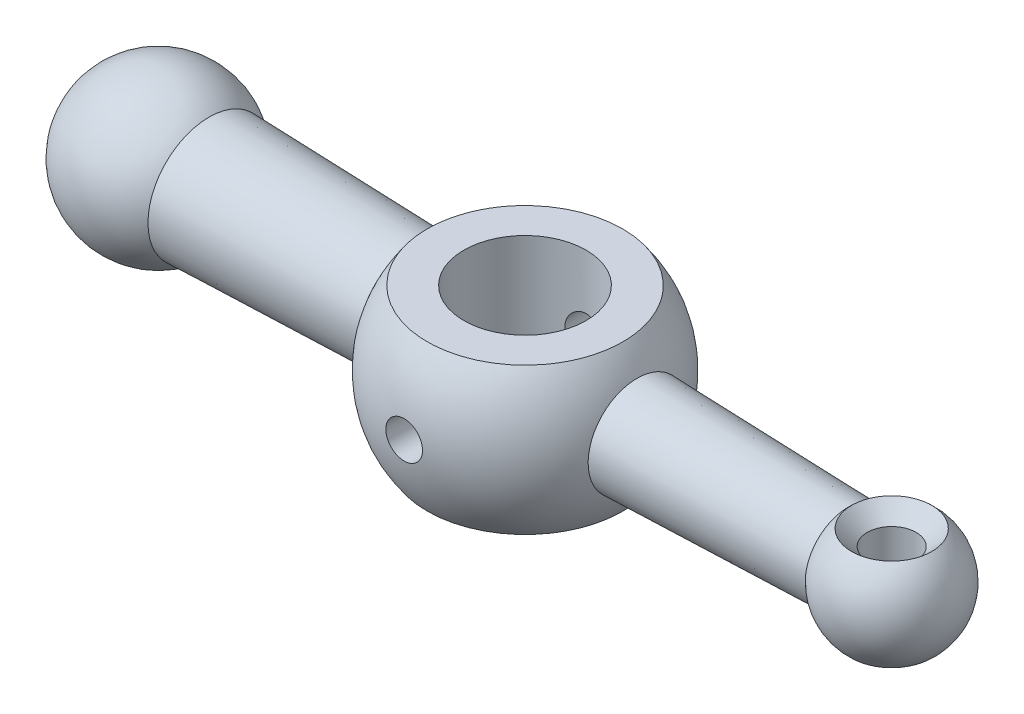
ISO-10303-21;
HEADER;
FILE_DESCRIPTION(('STEP AP214'),'2;1');
FILE_NAME('part.step','',(''),(''),'','','');
FILE_SCHEMA(('AUTOMOTIVE_DESIGN { 1 0 10303 214 1 1 1 1 }'));
ENDSEC;
DATA;
#1=APPLICATION_CONTEXT('core data for automotive mechanical design processes');
#2=APPLICATION_PROTOCOL_DEFINITION('international standard','automotive_design',2000,#1);
#3=PRODUCT_CONTEXT('',#1,'mechanical');
#4=PRODUCT('Part','Part','',(#3));
#5=PRODUCT_RELATED_PRODUCT_CATEGORY('part','',(#4));
#6=PRODUCT_DEFINITION_FORMATION('','',#4);
#7=PRODUCT_DEFINITION_CONTEXT('part definition',#1,'design');
#8=PRODUCT_DEFINITION('design','',#6,#7);
#9=PRODUCT_DEFINITION_SHAPE('','',#8);
#10=(LENGTH_UNIT() NAMED_UNIT(*) SI_UNIT(.MILLI.,.METRE.));
#11=(NAMED_UNIT(*) PLANE_ANGLE_UNIT() SI_UNIT($,.RADIAN.));
#12=(NAMED_UNIT(*) SI_UNIT($,.STERADIAN.) SOLID_ANGLE_UNIT());
#13=UNCERTAINTY_MEASURE_WITH_UNIT(LENGTH_MEASURE(1.E-05),#10,'distance_accuracy_value','');
#14=(GEOMETRIC_REPRESENTATION_CONTEXT(3) GLOBAL_UNCERTAINTY_ASSIGNED_CONTEXT((#13)) GLOBAL_UNIT_ASSIGNED_CONTEXT((#10,
#11,#12)) REPRESENTATION_CONTEXT('',''));
#15=CARTESIAN_POINT('',(0.,0.,0.));
#16=DIRECTION('',(0.,0.,1.));
#17=DIRECTION('',(1.,0.,0.));
#18=AXIS2_PLACEMENT_3D('',#15,#16,#17);
#19=CARTESIAN_POINT('',(60.,0.,0.));
#20=DIRECTION('',(-1.,0.,0.));
#21=DIRECTION('',(0.,-1.,0.));
#22=AXIS2_PLACEMENT_3D('',#19,#20,#21);
#23=SPHERICAL_SURFACE('',#22,10.);
#24=CARTESIAN_POINT('',(60.,-7.55336798983293,0.));
#25=DIRECTION('',(0.,-1.,0.));
#26=DIRECTION('',(0.,0.,-1.));
#27=AXIS2_PLACEMENT_3D('',#24,#25,#26);
#28=CIRCLE('',#27,6.55336798983296);
#29=CARTESIAN_POINT('',(60.,-7.55336798983293,-6.55336798983296));
#30=VERTEX_POINT('',#29);
#31=EDGE_CURVE('E10',#30,#30,#28,.F.);
#32=ORIENTED_EDGE('',*,*,#31,.T.);
#33=EDGE_LOOP('',(#32));
#34=FACE_BOUND('',#33,.T.);
#35=CARTESIAN_POINT('',(60.,7.55336798983292,0.));
#36=DIRECTION('',(0.,1.,0.));
#37=DIRECTION('',(0.,0.,1.));
#38=AXIS2_PLACEMENT_3D('',#35,#36,#37);
#39=CIRCLE('',#38,6.55336798983296);
#40=CARTESIAN_POINT('',(60.,7.55336798983292,6.55336798983296));
#41=VERTEX_POINT('',#40);
#42=EDGE_CURVE('E49',#41,#41,#39,.F.);
#43=ORIENTED_EDGE('',*,*,#42,.T.);
#44=EDGE_LOOP('',(#43));
#45=FACE_BOUND('',#44,.T.);
#46=CARTESIAN_POINT('',(52.8717651351015,0.,0.));
#47=DIRECTION('',(-1.,0.,0.));
#48=DIRECTION('',(0.,-1.,0.));
#49=AXIS2_PLACEMENT_3D('',#46,#47,#48);
#50=CIRCLE('',#49,7.01343480121155);
#51=CARTESIAN_POINT('',(52.8717651351015,-7.01343480121155,0.));
#52=VERTEX_POINT('',#51);
#53=EDGE_CURVE('E121',#52,#52,#50,.T.);
#54=ORIENTED_EDGE('',*,*,#53,.F.);
#55=EDGE_LOOP('',(#54));
#56=FACE_BOUND('',#55,.T.);
#57=ADVANCED_FACE('F37',(#34,#45,#56),#23,.T.);
#58=CARTESIAN_POINT('',(0.,0.,0.));
#59=DIRECTION('',(-1.,0.,0.));
#60=DIRECTION('',(0.,1.,0.));
#61=AXIS2_PLACEMENT_3D('',#58,#59,#60);
#62=SPHERICAL_SURFACE('',#61,20.);
#63=CARTESIAN_POINT('',(0.,0.,19.7737199332852));
#64=DIRECTION('',(0.,0.,-1.));
#65=DIRECTION('',(-1.,0.,0.));
#66=AXIS2_PLACEMENT_3D('',#63,#64,#65);
#67=CIRCLE('',#66,3.);
#68=CARTESIAN_POINT('',(-3.,0.,19.7737199332852));
#69=VERTEX_POINT('',#68);
#70=EDGE_CURVE('E232',#69,#69,#67,.T.);
#71=ORIENTED_EDGE('',*,*,#70,.T.);
#72=EDGE_LOOP('',(#71));
#73=FACE_BOUND('',#72,.T.);
#74=CARTESIAN_POINT('',(0.,0.,-19.7737199332852));
#75=DIRECTION('',(0.,0.,1.));
#76=DIRECTION('',(1.,0.,0.));
#77=AXIS2_PLACEMENT_3D('',#74,#75,#76);
#78=CIRCLE('',#77,3.);
#79=CARTESIAN_POINT('',(3.,0.,-19.7737199332852));
#80=VERTEX_POINT('',#79);
#81=EDGE_CURVE('E235',#80,#80,#78,.T.);
#82=ORIENTED_EDGE('',*,*,#81,.T.);
#83=EDGE_LOOP('',(#82));
#84=FACE_BOUND('',#83,.T.);
#85=CARTESIAN_POINT('',(0.,12.,0.));
#86=DIRECTION('',(0.,-1.,0.));
#87=DIRECTION('',(0.,0.,-1.));
#88=AXIS2_PLACEMENT_3D('',#85,#86,#87);
#89=CIRCLE('',#88,16.);
#90=CARTESIAN_POINT('',(0.,12.,-16.));
#91=VERTEX_POINT('',#90);
#92=EDGE_CURVE('E109',#91,#91,#89,.T.);
#93=ORIENTED_EDGE('',*,*,#92,.T.);
#94=EDGE_LOOP('',(#93));
#95=FACE_BOUND('',#94,.T.);
#96=CARTESIAN_POINT('',(-17.8438045926734,0.,0.));
#97=DIRECTION('',(-1.,0.,0.));
#98=DIRECTION('',(0.,-1.,0.));
#99=AXIS2_PLACEMENT_3D('',#96,#97,#98);
#100=CIRCLE('',#99,9.03319642532417);
#101=CARTESIAN_POINT('',(-17.8438045926734,-9.03319642532417,0.));
#102=VERTEX_POINT('',#101);
#103=EDGE_CURVE('E108',#102,#102,#100,.T.);
#104=ORIENTED_EDGE('',*,*,#103,.F.);
#105=EDGE_LOOP('',(#104));
#106=FACE_BOUND('',#105,.T.);
#107=CARTESIAN_POINT('',(18.3303027798234,0.,0.));
#108=DIRECTION('',(-1.,0.,0.));
#109=DIRECTION('',(0.,-1.,0.));
#110=AXIS2_PLACEMENT_3D('',#107,#108,#109);
#111=CIRCLE('',#110,8.00000000000001);
#112=CARTESIAN_POINT('',(18.3303027798234,-8.00000000000001,0.));
#113=VERTEX_POINT('',#112);
#114=EDGE_CURVE('E112',#113,#113,#111,.T.);
#115=ORIENTED_EDGE('',*,*,#114,.T.);
#116=EDGE_LOOP('',(#115));
#117=FACE_BOUND('',#116,.T.);
#118=CARTESIAN_POINT('',(0.,-12.,0.));
#119=DIRECTION('',(0.,-1.,0.));
#120=DIRECTION('',(0.,0.,-1.));
#121=AXIS2_PLACEMENT_3D('',#118,#119,#120);
#122=CIRCLE('',#121,16.);
#123=CARTESIAN_POINT('',(0.,-12.,-16.));
#124=VERTEX_POINT('',#123);
#125=EDGE_CURVE('E115',#124,#124,#122,.T.);
#126=ORIENTED_EDGE('',*,*,#125,.F.);
#127=EDGE_LOOP('',(#126));
#128=FACE_BOUND('',#127,.T.);
#129=ADVANCED_FACE('F85',(#73,#84,#95,#106,#117,#128),#62,.T.);
#130=CARTESIAN_POINT('',(-60.,0.,0.));
#131=DIRECTION('',(-1.,0.,0.));
#132=DIRECTION('',(0.,1.,0.));
#133=AXIS2_PLACEMENT_3D('',#130,#131,#132);
#134=SPHERICAL_SURFACE('',#133,13.);
#135=CARTESIAN_POINT('',(-51.6933761370819,0.,0.));
#136=DIRECTION('',(-1.,0.,0.));
#137=DIRECTION('',(0.,-1.,0.));
#138=AXIS2_PLACEMENT_3D('',#135,#136,#137);
#139=CIRCLE('',#138,10.);
#140=CARTESIAN_POINT('',(-51.6933761370819,-10.,0.));
#141=VERTEX_POINT('',#140);
#142=EDGE_CURVE('E106',#141,#141,#139,.T.);
#143=ORIENTED_EDGE('',*,*,#142,.T.);
#144=EDGE_LOOP('',(#143));
#145=FACE_BOUND('',#144,.T.);
#146=ADVANCED_FACE('F90',(#145),#134,.T.);
#147=CARTESIAN_POINT('',(52.8717651351015,0.,0.));
#148=DIRECTION('',(-1.,0.,0.));
#149=DIRECTION('',(0.,-1.,0.));
#150=AXIS2_PLACEMENT_3D('',#147,#148,#149);
#151=CONICAL_SURFACE('',#150,7.01343480121155,0.0285540041208688);
#152=ORIENTED_EDGE('',*,*,#114,.F.);
#153=EDGE_LOOP('',(#152));
#154=FACE_BOUND('',#153,.T.);
#155=ORIENTED_EDGE('',*,*,#53,.T.);
#156=EDGE_LOOP('',(#155));
#157=FACE_BOUND('',#156,.T.);
#158=ADVANCED_FACE('F96',(#154,#157),#151,.T.);
#159=CARTESIAN_POINT('',(-17.8438045926734,0.,0.));
#160=DIRECTION('',(-1.,0.,0.));
#161=DIRECTION('',(0.,-1.,0.));
#162=AXIS2_PLACEMENT_3D('',#159,#160,#161);
#163=CONICAL_SURFACE('',#162,9.03319642532417,0.0285540041208687);
#164=ORIENTED_EDGE('',*,*,#142,.F.);
#165=EDGE_LOOP('',(#164));
#166=FACE_BOUND('',#165,.T.);
#167=ORIENTED_EDGE('',*,*,#103,.T.);
#168=EDGE_LOOP('',(#167));
#169=FACE_BOUND('',#168,.T.);
#170=ADVANCED_FACE('F102',(#166,#169),#163,.T.);
#171=CARTESIAN_POINT('',(10.,12.,0.));
#172=DIRECTION('',(0.,-1.,0.));
#173=DIRECTION('',(0.,0.,-1.));
#174=AXIS2_PLACEMENT_3D('',#171,#172,#173);
#175=PLANE('',#174);
#176=ORIENTED_EDGE('',*,*,#92,.F.);
#177=EDGE_LOOP('',(#176));
#178=FACE_BOUND('',#177,.T.);
#179=CARTESIAN_POINT('',(0.,12.,0.));
#180=DIRECTION('',(0.,-1.,0.));
#181=DIRECTION('',(0.,0.,-1.));
#182=AXIS2_PLACEMENT_3D('',#179,#180,#181);
#183=CIRCLE('',#182,10.);
#184=CARTESIAN_POINT('',(0.,12.,-10.));
#185=VERTEX_POINT('',#184);
#186=EDGE_CURVE('E227',#185,#185,#183,.T.);
#187=ORIENTED_EDGE('',*,*,#186,.T.);
#188=EDGE_LOOP('',(#187));
#189=FACE_BOUND('',#188,.T.);
#190=ADVANCED_FACE('F182',(#178,#189),#175,.F.);
#191=CARTESIAN_POINT('',(10.,-12.,0.));
#192=DIRECTION('',(0.,-1.,0.));
#193=DIRECTION('',(0.,0.,-1.));
#194=AXIS2_PLACEMENT_3D('',#191,#192,#193);
#195=PLANE('',#194);
#196=ORIENTED_EDGE('',*,*,#125,.T.);
#197=EDGE_LOOP('',(#196));
#198=FACE_BOUND('',#197,.T.);
#199=CARTESIAN_POINT('',(0.,-12.,0.));
#200=DIRECTION('',(0.,-1.,0.));
#201=DIRECTION('',(0.,0.,-1.));
#202=AXIS2_PLACEMENT_3D('',#199,#200,#201);
#203=CIRCLE('',#202,10.);
#204=CARTESIAN_POINT('',(0.,-12.,-10.));
#205=VERTEX_POINT('',#204);
#206=EDGE_CURVE('E225',#205,#205,#203,.T.);
#207=ORIENTED_EDGE('',*,*,#206,.F.);
#208=EDGE_LOOP('',(#207));
#209=FACE_BOUND('',#208,.T.);
#210=ADVANCED_FACE('F80',(#198,#209),#195,.T.);
#211=CARTESIAN_POINT('',(0.,0.,0.));
#212=DIRECTION('',(0.,-1.,0.));
#213=DIRECTION('',(0.,0.,-1.));
#214=AXIS2_PLACEMENT_3D('',#211,#212,#213);
#215=CYLINDRICAL_SURFACE('',#214,10.);
#216=CARTESIAN_POINT('',(0.,3.,-10.));
#217=CARTESIAN_POINT('',(-0.1645772255066,2.99999800503023,-9.99999858501101));
#218=CARTESIAN_POINT('',(-0.329174636703059,2.98641227275207,-9.99589831387907));
#219=CARTESIAN_POINT('',(-0.653576250609761,2.9325572915558,-9.97994211187382));
#220=CARTESIAN_POINT('',(-0.81337900882284,2.89228008395332,-9.96808386779384));
#221=CARTESIAN_POINT('',(-1.12346541550905,2.78650796617947,-9.93791105003673));
#222=CARTESIAN_POINT('',(-1.27376272879075,2.72105026076213,-9.91960600500851));
#223=CARTESIAN_POINT('',(-1.56124836210626,2.56692781388833,-9.87844218475291));
#224=CARTESIAN_POINT('',(-1.69843493493934,2.47825998520917,-9.85558280384133));
#225=CARTESIAN_POINT('',(-1.95974359436749,2.27755198505466,-9.80701474385548));
#226=CARTESIAN_POINT('',(-2.08343614248868,2.16496674822817,-9.78124767314073));
#227=CARTESIAN_POINT('',(-2.31049841846647,1.92078154017963,-9.73011668420884));
#228=CARTESIAN_POINT('',(-2.41386472654882,1.78917837575008,-9.70475283449003));
#229=CARTESIAN_POINT('',(-2.59960075447415,1.50705849392478,-9.65668227987544));
#230=CARTESIAN_POINT('',(-2.68144618044427,1.35618307801852,-9.63404813327749));
#231=CARTESIAN_POINT('',(-2.81842789549521,1.04202149153941,-9.59487240788062));
#232=CARTESIAN_POINT('',(-2.87357059839947,0.878738312144049,-9.57832936626621));
#233=CARTESIAN_POINT('',(-2.95403267365303,0.549219467739081,-9.55381741676869));
#234=CARTESIAN_POINT('',(-2.98014392469355,0.383194512272113,-9.54562138649067));
#235=CARTESIAN_POINT('',(-3.00427461229344,0.0489336875664681,-9.53805579499535));
#236=CARTESIAN_POINT('',(-3.00230085522157,-0.119301636118176,-9.53868409521143));
#237=CARTESIAN_POINT('',(-2.97093954399623,-0.446767817216968,-9.54849488135556));
#238=CARTESIAN_POINT('',(-2.9425441052537,-0.606104500724479,-9.55736777198281));
#239=CARTESIAN_POINT('',(-2.86074840854112,-0.917639572546922,-9.58216712457249));
#240=CARTESIAN_POINT('',(-2.80734568283282,-1.06983725474867,-9.59809428264701));
#241=CARTESIAN_POINT('',(-2.67632053307363,-1.36520069932148,-9.63545466149946));
#242=CARTESIAN_POINT('',(-2.59837633869285,-1.50821416791053,-9.65696032231904));
#243=CARTESIAN_POINT('',(-2.42070445177367,-1.77946404402039,-9.70301974000129));
#244=CARTESIAN_POINT('',(-2.32097148005177,-1.90769685882756,-9.72757423493982));
#245=CARTESIAN_POINT('',(-2.09762581531093,-2.15137238152404,-9.77822022595875));
#246=CARTESIAN_POINT('',(-1.97318981493394,-2.26605732805934,-9.80433308620996));
#247=CARTESIAN_POINT('',(-1.70652651862793,-2.4731079681285,-9.85424488126517));
#248=CARTESIAN_POINT('',(-1.56429810372177,-2.56547225682885,-9.87804367036821));
#249=CARTESIAN_POINT('',(-1.2647100766856,-2.72571984492946,-9.92086320138941));
#250=CARTESIAN_POINT('',(-1.1072554994959,-2.79343503249972,-9.93985087336628));
#251=CARTESIAN_POINT('',(-0.782490831207038,-2.90119918019926,-9.97067043664444));
#252=CARTESIAN_POINT('',(-0.615183503179162,-2.94125585706498,-9.98250432373999));
#253=CARTESIAN_POINT('',(-0.281904485336662,-2.99130435579879,-9.99736729287077));
#254=CARTESIAN_POINT('',(-0.116100195202373,-3.00232317160322,-10.0006970083558));
#255=CARTESIAN_POINT('',(0.214999211646767,-2.99686168857584,-9.9990584648352));
#256=CARTESIAN_POINT('',(0.380294393381562,-2.98038506069712,-9.99409131355514));
#257=CARTESIAN_POINT('',(0.701807210619394,-2.92123077777701,-9.97661393974325));
#258=CARTESIAN_POINT('',(0.858145545228338,-2.87915322483826,-9.96427659598829));
#259=CARTESIAN_POINT('',(1.16150927790904,-2.7707135344436,-9.9334869568307));
#260=CARTESIAN_POINT('',(1.30853355405117,-2.70434847792428,-9.91503392642188));
#261=CARTESIAN_POINT('',(1.5928743789221,-2.54749366903773,-9.87339308702631));
#262=CARTESIAN_POINT('',(1.72988765239934,-2.45648131810404,-9.8501056165928));
#263=CARTESIAN_POINT('',(1.9870466159603,-2.25355049189439,-9.80146937528705));
#264=CARTESIAN_POINT('',(2.10718806471188,-2.1416267762247,-9.7761200886242));
#265=CARTESIAN_POINT('',(2.33171489102052,-1.89522538326126,-9.72506343738007));
#266=CARTESIAN_POINT('',(2.43536962463001,-1.76007624845635,-9.69937650065513));
#267=CARTESIAN_POINT('',(2.61857990144313,-1.47374412197311,-9.65153030477949));
#268=CARTESIAN_POINT('',(2.69813607658965,-1.32256155088424,-9.62937095313121));
#269=CARTESIAN_POINT('',(2.83034694254316,-1.00893501748996,-9.5913437922631));
#270=CARTESIAN_POINT('',(2.88312693874021,-0.846547626924334,-9.57544675673501));
#271=CARTESIAN_POINT('',(2.96043461630306,-0.514624062139527,-9.55183188739737));
#272=CARTESIAN_POINT('',(2.98497197957849,-0.345090358433925,-9.54411125069387));
#273=CARTESIAN_POINT('',(3.0044396896993,-0.0112769632231555,-9.53799944941559));
#274=CARTESIAN_POINT('',(3.00056110615887,0.152927302098846,-9.53923294700395));
#275=CARTESIAN_POINT('',(2.9661501088861,0.478228206801232,-9.54998802392189));
#276=CARTESIAN_POINT('',(2.93561876249408,0.639324970361026,-9.55950927135902));
#277=CARTESIAN_POINT('',(2.84953777608686,0.951890798263349,-9.58551527389243));
#278=CARTESIAN_POINT('',(2.79430351014248,1.10345457471739,-9.60191209104934));
#279=CARTESIAN_POINT('',(2.66063014242147,1.39528487764145,-9.63980557805266));
#280=CARTESIAN_POINT('',(2.58218659925722,1.53554923528315,-9.6613032238508));
#281=CARTESIAN_POINT('',(2.40097527610175,1.80632623305253,-9.70795352855338));
#282=CARTESIAN_POINT('',(2.29742552185996,1.93629752252037,-9.7332108032858));
#283=CARTESIAN_POINT('',(2.07034869259555,2.17740499661618,-9.78402640899067));
#284=CARTESIAN_POINT('',(1.94681643426898,2.28853627893564,-9.80958481647543));
#285=CARTESIAN_POINT('',(1.67893152436652,2.49204682458993,-9.85901873141573));
#286=CARTESIAN_POINT('',(1.53407577158122,2.58378289371095,-9.88282319531422));
#287=CARTESIAN_POINT('',(1.23028274796705,2.74147033980808,-9.92521360911553));
#288=CARTESIAN_POINT('',(1.07135210599791,2.80743377654903,-9.94380199862114));
#289=CARTESIAN_POINT('',(0.761515425310562,2.90579055130549,-9.97204349938619));
#290=CARTESIAN_POINT('',(0.611573923908466,2.94102334576649,-9.9824405476214));
#291=CARTESIAN_POINT('',(0.307760390461557,2.98812705048316,-9.9964188898898));
#292=CARTESIAN_POINT('',(0.153889019716278,3.00000186540964,-10.0000013230948));
#293=CARTESIAN_POINT('',(0.,3.,-10.));
#294=B_SPLINE_CURVE_WITH_KNOTS('',3,(#216,#217,#218,#219,#220,#221,#222,#223,#224,#225,#226,
#227,#228,#229,#230,#231,#232,#233,#234,#235,#236,#237,#238,#239,#240,#241,#242,#243,#244,#245,
#246,#247,#248,#249,#250,#251,#252,#253,#254,#255,#256,#257,#258,#259,#260,#261,#262,#263,#264,
#265,#266,#267,#268,#269,#270,#271,#272,#273,#274,#275,#276,#277,#278,#279,#280,#281,#282,#283,
#284,#285,#286,#287,#288,#289,#290,#291,#292,#293),.UNSPECIFIED.,.T.,.F.,(4,2,2,2,2,2,2,2,2,2,2,
2,2,2,2,2,2,2,2,2,2,2,2,2,2,2,2,2,2,2,2,2,2,2,2,2,2,2,4),(0.,0.493166407225221,
0.986479929691999,1.47906735260175,1.9717203288254,2.47711205896383,2.98258874577266,
3.49942962008218,4.01614629086447,4.51839378713198,5.02051956638179,5.50452033395352,
5.98856887316002,6.47924852894239,6.97004720317111,7.48134208096333,7.99266913062143,
8.50742093763377,9.02202907057615,9.5181761887709,10.0142570710065,10.4991349336465,
10.9840710918746,11.4802261140582,11.9765056400038,12.4908080064564,13.0050968850536,
13.516956299025,14.0286401892057,14.5190031093854,15.0093463933232,15.4936008081456,
15.9779479511534,16.4799385136898,16.9820594980413,17.4988599232246,18.0154182319959,
18.4766338387004,18.9377723390687),.UNSPECIFIED.);
#295=CARTESIAN_POINT('',(0.,3.,-10.));
#296=VERTEX_POINT('',#295);
#297=EDGE_CURVE('E41',#296,#296,#294,.T.);
#298=ORIENTED_EDGE('',*,*,#297,.F.);
#299=EDGE_LOOP('',(#298));
#300=FACE_BOUND('',#299,.T.);
#301=CARTESIAN_POINT('',(3.,0.,9.53939201416946));
#302=CARTESIAN_POINT('',(2.99999795267528,-0.164389095884807,9.5393937145396));
#303=CARTESIAN_POINT('',(2.98644216334284,-0.32879844828805,9.54368780418138));
#304=CARTESIAN_POINT('',(2.93271688893498,-0.652810499183886,9.560331566058));
#305=CARTESIAN_POINT('',(2.89253851147156,-0.812411573002932,9.57268392986936));
#306=CARTESIAN_POINT('',(2.78705506539911,-1.12206945654346,9.60392204971265));
#307=CARTESIAN_POINT('',(2.72179178788487,-1.27214165926617,9.62279693406465));
#308=CARTESIAN_POINT('',(2.56812843835858,-1.5592438679906,9.66493865095134));
#309=CARTESIAN_POINT('',(2.47972490274105,-1.69627191736888,9.68820614082039));
#310=CARTESIAN_POINT('',(2.27929508283254,-1.95773278115475,9.73733724371531));
#311=CARTESIAN_POINT('',(2.16666414351613,-2.08169179589258,9.76325616623271));
#312=CARTESIAN_POINT('',(1.9222724751592,-2.30927590264502,9.81429723873514));
#313=CARTESIAN_POINT('',(1.79050929092222,-2.41289838089976,9.8394192859541));
#314=CARTESIAN_POINT('',(1.50822287558738,-2.59892539966661,9.88666429158778));
#315=CARTESIAN_POINT('',(1.35736804267163,-2.68084684888562,9.90871448684808));
#316=CARTESIAN_POINT('',(1.04324929073871,-2.81797451808551,9.94668871841369));
#317=CARTESIAN_POINT('',(0.879988056775822,-2.8731864997149,9.96261407578992));
#318=CARTESIAN_POINT('',(0.550647705261658,-2.95376000218102,9.98615292007178));
#319=CARTESIAN_POINT('',(0.384782797907602,-2.97993025530541,9.99399114738674));
#320=CARTESIAN_POINT('',(0.0508436474986268,-3.00423464929288,10.001264030027));
#321=CARTESIAN_POINT('',(-0.117230124100744,-3.00237467880391,10.0007004504217));
#322=CARTESIAN_POINT('',(-0.445142313200316,-2.97121426291396,9.99139207635305));
#323=CARTESIAN_POINT('',(-0.605072535282662,-2.9427896123803,9.98290840410476));
#324=CARTESIAN_POINT('',(-0.917778426885077,-2.86073732801138,9.95903044225231));
#325=CARTESIAN_POINT('',(-1.07055364264578,-2.8071080981145,9.94363571501341));
#326=CARTESIAN_POINT('',(-1.36669465270248,-2.67557595316304,9.90730441973756));
#327=CARTESIAN_POINT('',(-1.50993012938864,-2.59739759438605,9.88630539352773));
#328=CARTESIAN_POINT('',(-1.78152934756663,-2.41920429514295,9.84099281296778));
#329=CARTESIAN_POINT('',(-1.90988954974545,-2.31918417407083,9.81667847277943));
#330=CARTESIAN_POINT('',(-2.15332096305837,-2.09560449849909,9.76623100973852));
#331=CARTESIAN_POINT('',(-2.26768916079755,-1.97128616194922,9.74006390633503));
#332=CARTESIAN_POINT('',(-2.47415303080115,-1.7049799642112,9.68967959784414));
#333=CARTESIAN_POINT('',(-2.56624648967452,-1.56299034918903,9.66546258669242));
#334=CARTESIAN_POINT('',(-2.72627990669511,-1.26352106152783,9.62155806359712));
#335=CARTESIAN_POINT('',(-2.79397978469378,-1.10590590838251,9.60191621258491));
#336=CARTESIAN_POINT('',(-2.90166725750739,-0.7807855832214,9.5699278496379));
#337=CARTESIAN_POINT('',(-2.94166389279494,-0.613283656964942,9.5575789579664));
#338=CARTESIAN_POINT('',(-2.99149540565762,-0.279835278497562,9.54209699116239));
#339=CARTESIAN_POINT('',(-3.00239892760807,-0.114063552205644,9.53863757349918));
#340=CARTESIAN_POINT('',(-2.99671894465741,0.216945800013345,9.54042384874813));
#341=CARTESIAN_POINT('',(-2.98013928742559,0.382183497460005,9.54566832310787));
#342=CARTESIAN_POINT('',(-2.92091527148479,0.702976755943391,9.56395117112154));
#343=CARTESIAN_POINT('',(-2.87895922862587,0.85867232852749,9.57678353015602));
#344=CARTESIAN_POINT('',(-2.77097155495853,1.16080338162939,9.6085828246183));
#345=CARTESIAN_POINT('',(-2.70493620685512,1.30723742828102,9.62755070717977));
#346=CARTESIAN_POINT('',(-2.54863742393008,1.59103492814439,9.67011670046269));
#347=CARTESIAN_POINT('',(-2.4577712834546,1.72804944197162,9.69382542139644));
#348=CARTESIAN_POINT('',(-2.25510603200767,1.98527621236158,9.74296411293928));
#349=CARTESIAN_POINT('',(-2.14330191069792,2.10548443522557,9.76839449459994));
#350=CARTESIAN_POINT('',(-1.8969102649872,2.33036081162948,9.8192726709633));
#351=CARTESIAN_POINT('',(-1.76162213171487,2.43427125797397,9.84468490126012));
#352=CARTESIAN_POINT('',(-1.47492356918049,2.6179334020555,9.89169703497298));
#353=CARTESIAN_POINT('',(-1.32351394108789,2.69768629956292,9.91329712769433));
#354=CARTESIAN_POINT('',(-1.00987100941044,2.83000006113659,9.95011940949915));
#355=CARTESIAN_POINT('',(-0.847729244075675,2.88276403231795,9.96538906849932));
#356=CARTESIAN_POINT('',(-0.516339933009174,2.96012183778084,9.98803959193654));
#357=CARTESIAN_POINT('',(-0.347094434709524,2.98472373189683,9.9954227134176));
#358=CARTESIAN_POINT('',(-0.0133043077654847,3.004446088109,10.001330881628));
#359=CARTESIAN_POINT('',(0.151170358172414,3.00066539081567,10.0001861022264));
#360=CARTESIAN_POINT('',(0.477038962328808,2.96635673500176,9.98994528930073));
#361=CARTESIAN_POINT('',(0.638433074693058,2.93583029303912,9.98084970660925));
#362=CARTESIAN_POINT('',(0.951871626082717,2.84957667720075,9.95582336716653));
#363=CARTESIAN_POINT('',(1.10399785470278,2.79412363870197,9.93996705801732));
#364=CARTESIAN_POINT('',(1.39686647550411,2.65983617098562,9.903058860789));
#365=CARTESIAN_POINT('',(1.53760699210116,2.58099789942762,9.88200611899892));
#366=CARTESIAN_POINT('',(1.80860378484113,2.39925308513993,9.83607931656457));
#367=CARTESIAN_POINT('',(1.93838050015354,2.29565713999847,9.81110453847119));
#368=CARTESIAN_POINT('',(2.17907514269189,2.0685792233344,9.76047074424668));
#369=CARTESIAN_POINT('',(2.28998761920387,1.9450915242037,9.73481153282158));
#370=CARTESIAN_POINT('',(2.49312538789097,1.67731844337898,9.68481361262638));
#371=CARTESIAN_POINT('',(2.58469519515913,1.53252289321912,9.66053705386971));
#372=CARTESIAN_POINT('',(2.74208627057551,1.22888965167796,9.61705095017586));
#373=CARTESIAN_POINT('',(2.80791991114577,1.07005875279761,9.59783897193911));
#374=CARTESIAN_POINT('',(2.90603885065899,0.760519136787451,9.56855633435189));
#375=CARTESIAN_POINT('',(2.94117718022463,0.610782706138015,9.5577230968104));
#376=CARTESIAN_POINT('',(2.98815637670288,0.307369555008454,9.54314085194333));
#377=CARTESIAN_POINT('',(3.00000191412191,0.153693630709505,9.53939042442861));
#378=CARTESIAN_POINT('',(3.,0.,9.53939201416946));
#379=B_SPLINE_CURVE_WITH_KNOTS('',3,(#301,#302,#303,#304,#305,#306,#307,#308,#309,#310,#311,
#312,#313,#314,#315,#316,#317,#318,#319,#320,#321,#322,#323,#324,#325,#326,#327,#328,#329,#330,
#331,#332,#333,#334,#335,#336,#337,#338,#339,#340,#341,#342,#343,#344,#345,#346,#347,#348,#349,
#350,#351,#352,#353,#354,#355,#356,#357,#358,#359,#360,#361,#362,#363,#364,#365,#366,#367,#368,
#369,#370,#371,#372,#373,#374,#375,#376,#377,#378),.UNSPECIFIED.,.T.,.F.,(4,2,2,2,2,2,2,2,2,2,2,
2,2,2,2,2,2,2,2,2,2,2,2,2,2,2,2,2,2,2,2,2,2,2,2,2,2,2,4),(0.,0.492600331831085,0.985365283378,
1.47731282893239,1.9693340507402,2.47546300015968,2.98165695742546,3.49831878547289,
4.01486911175754,4.51664280299115,5.01831108202881,5.5040025198176,5.98972471780752,
6.48110418671352,6.97260033181661,7.48304294046556,7.99353624983726,8.50892476494934,
9.02414501262032,9.52016161585828,10.0161087821998,10.4991718988284,10.9823096209678,
11.4784146362399,11.9746385186306,12.4895901220641,13.0045161465361,13.5155078363386,
14.0263532464857,14.5175260782765,15.0086710610072,15.4945419374965,15.9804926898797,
16.4819925411419,16.9836370526499,17.500232793435,18.016579879331,18.477223077201,
18.9377739007233),.UNSPECIFIED.);
#380=CARTESIAN_POINT('',(3.,0.,9.53939201416946));
#381=VERTEX_POINT('',#380);
#382=EDGE_CURVE('E57',#381,#381,#379,.T.);
#383=ORIENTED_EDGE('',*,*,#382,.F.);
#384=EDGE_LOOP('',(#383));
#385=FACE_BOUND('',#384,.T.);
#386=ORIENTED_EDGE('',*,*,#206,.T.);
#387=EDGE_LOOP('',(#386));
#388=FACE_BOUND('',#387,.T.);
#389=ORIENTED_EDGE('',*,*,#186,.F.);
#390=EDGE_LOOP('',(#389));
#391=FACE_BOUND('',#390,.T.);
#392=ADVANCED_FACE('F61',(#300,#385,#388,#391),#215,.F.);
#393=CARTESIAN_POINT('',(60.,-15.2723166447147,0.));
#394=DIRECTION('',(0.,-1.,0.));
#395=DIRECTION('',(1.,0.,0.));
#396=AXIS2_PLACEMENT_3D('',#393,#394,#395);
#397=CYLINDRICAL_SURFACE('',#396,4.00000000000001);
#398=CARTESIAN_POINT('',(60.,-4.99999999999995,0.));
#399=DIRECTION('',(0.,-1.,0.));
#400=DIRECTION('',(0.,0.,-1.));
#401=AXIS2_PLACEMENT_3D('',#398,#399,#400);
#402=CIRCLE('',#401,4.00000000000001);
#403=CARTESIAN_POINT('',(60.,-4.99999999999995,-4.00000000000001));
#404=VERTEX_POINT('',#403);
#405=EDGE_CURVE('E54',#404,#404,#402,.T.);
#406=ORIENTED_EDGE('',*,*,#405,.T.);
#407=EDGE_LOOP('',(#406));
#408=FACE_BOUND('',#407,.T.);
#409=CARTESIAN_POINT('',(60.,4.99999999999998,0.));
#410=DIRECTION('',(0.,-1.,0.));
#411=DIRECTION('',(0.,0.,-1.));
#412=AXIS2_PLACEMENT_3D('',#409,#410,#411);
#413=CIRCLE('',#412,4.00000000000001);
#414=CARTESIAN_POINT('',(60.,4.99999999999998,-4.00000000000001));
#415=VERTEX_POINT('',#414);
#416=EDGE_CURVE('E124',#415,#415,#413,.F.);
#417=ORIENTED_EDGE('',*,*,#416,.T.);
#418=EDGE_LOOP('',(#417));
#419=FACE_BOUND('',#418,.T.);
#420=ADVANCED_FACE('F70',(#408,#419),#397,.F.);
#421=CARTESIAN_POINT('',(60.,-4.99999999999995,0.));
#422=DIRECTION('',(0.,-1.,0.));
#423=DIRECTION('',(0.,0.,-1.));
#424=AXIS2_PLACEMENT_3D('',#421,#422,#423);
#425=CONICAL_SURFACE('',#424,4.00000000000001,0.785398163397444);
#426=ORIENTED_EDGE('',*,*,#31,.F.);
#427=EDGE_LOOP('',(#426));
#428=FACE_BOUND('',#427,.T.);
#429=ORIENTED_EDGE('',*,*,#405,.F.);
#430=EDGE_LOOP('',(#429));
#431=FACE_BOUND('',#430,.T.);
#432=ADVANCED_FACE('F73',(#428,#431),#425,.F.);
#433=CARTESIAN_POINT('',(60.,8.,0.));
#434=DIRECTION('',(0.,1.,0.));
#435=DIRECTION('',(0.,0.,1.));
#436=AXIS2_PLACEMENT_3D('',#433,#434,#435);
#437=CONICAL_SURFACE('',#436,7.00000000000006,0.785398163397453);
#438=ORIENTED_EDGE('',*,*,#416,.F.);
#439=EDGE_LOOP('',(#438));
#440=FACE_BOUND('',#439,.T.);
#441=ORIENTED_EDGE('',*,*,#42,.F.);
#442=EDGE_LOOP('',(#441));
#443=FACE_BOUND('',#442,.T.);
#444=ADVANCED_FACE('F39',(#440,#443),#437,.F.);
#445=CARTESIAN_POINT('',(0.,0.,-50.));
#446=DIRECTION('',(0.,0.,1.));
#447=DIRECTION('',(1.,0.,0.));
#448=AXIS2_PLACEMENT_3D('',#445,#446,#447);
#449=CYLINDRICAL_SURFACE('',#448,3.);
#450=ORIENTED_EDGE('',*,*,#382,.T.);
#451=EDGE_LOOP('',(#450));
#452=FACE_BOUND('',#451,.T.);
#453=ORIENTED_EDGE('',*,*,#70,.F.);
#454=EDGE_LOOP('',(#453));
#455=FACE_BOUND('',#454,.T.);
#456=ADVANCED_FACE('F65',(#452,#455),#449,.F.);
#457=ORIENTED_EDGE('',*,*,#297,.T.);
#458=EDGE_LOOP('',(#457));
#459=FACE_BOUND('',#458,.T.);
#460=ORIENTED_EDGE('',*,*,#81,.F.);
#461=EDGE_LOOP('',(#460));
#462=FACE_BOUND('',#461,.T.);
#463=ADVANCED_FACE('F68',(#459,#462),#449,.F.);
#464=CLOSED_SHELL('',(#57,#129,#146,#158,#170,#190,#210,#392,#420,#432,#444,#456,#463));
#465=MANIFOLD_SOLID_BREP('B2',#464);
#466=ADVANCED_BREP_SHAPE_REPRESENTATION('',(#18,#465),#14);
#467=SHAPE_DEFINITION_REPRESENTATION(#9,#466);
ENDSEC;
END-ISO-10303-21;
